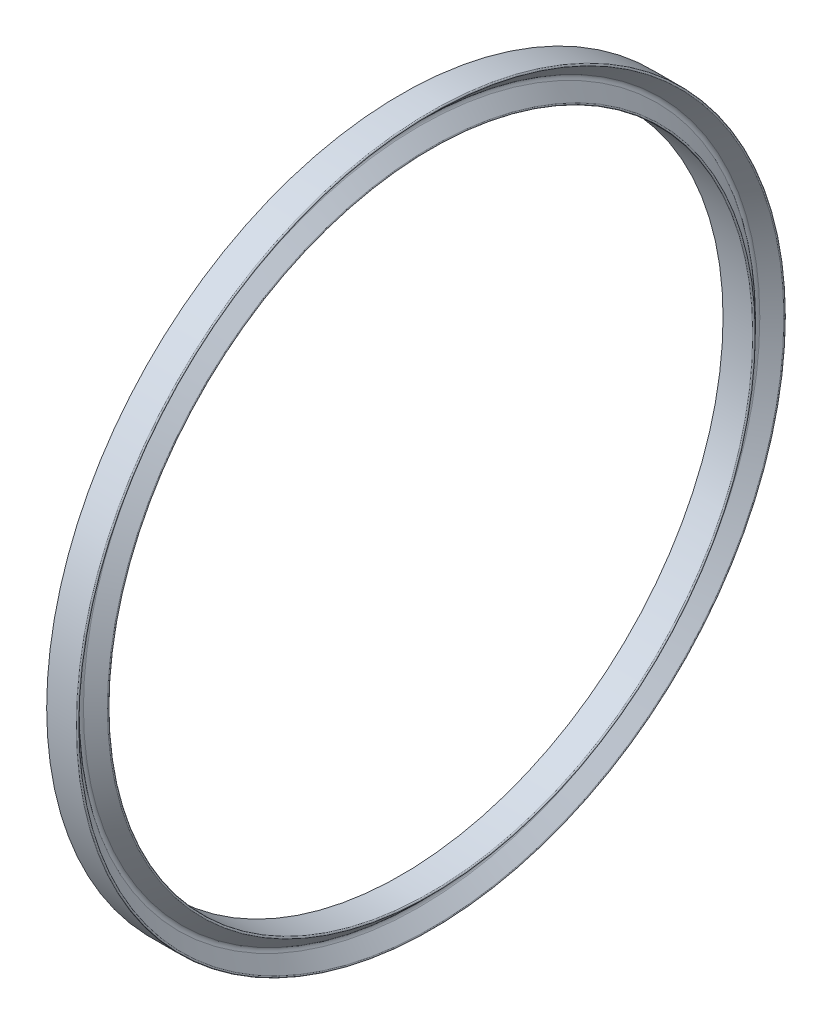
ISO-10303-21;
HEADER;
FILE_DESCRIPTION(('STEP AP214'),'2;1');
FILE_NAME('part.step','',(''),(''),'','','');
FILE_SCHEMA(('AUTOMOTIVE_DESIGN { 1 0 10303 214 1 1 1 1 }'));
ENDSEC;
DATA;
#1=APPLICATION_CONTEXT('core data for automotive mechanical design processes');
#2=APPLICATION_PROTOCOL_DEFINITION('international standard','automotive_design',2000,#1);
#3=PRODUCT_CONTEXT('',#1,'mechanical');
#4=PRODUCT('Part','Part','',(#3));
#5=PRODUCT_RELATED_PRODUCT_CATEGORY('part','',(#4));
#6=PRODUCT_DEFINITION_FORMATION('','',#4);
#7=PRODUCT_DEFINITION_CONTEXT('part definition',#1,'design');
#8=PRODUCT_DEFINITION('design','',#6,#7);
#9=PRODUCT_DEFINITION_SHAPE('','',#8);
#10=(LENGTH_UNIT() NAMED_UNIT(*) SI_UNIT(.MILLI.,.METRE.));
#11=(NAMED_UNIT(*) PLANE_ANGLE_UNIT() SI_UNIT($,.RADIAN.));
#12=(NAMED_UNIT(*) SI_UNIT($,.STERADIAN.) SOLID_ANGLE_UNIT());
#13=UNCERTAINTY_MEASURE_WITH_UNIT(LENGTH_MEASURE(1.E-05),#10,'distance_accuracy_value','');
#14=(GEOMETRIC_REPRESENTATION_CONTEXT(3) GLOBAL_UNCERTAINTY_ASSIGNED_CONTEXT((#13)) GLOBAL_UNIT_ASSIGNED_CONTEXT((#10,
#11,#12)) REPRESENTATION_CONTEXT('',''));
#15=CARTESIAN_POINT('',(0.,0.,0.));
#16=DIRECTION('',(0.,0.,1.));
#17=DIRECTION('',(1.,0.,0.));
#18=AXIS2_PLACEMENT_3D('',#15,#16,#17);
#19=CARTESIAN_POINT('',(-58.5481657407606,-30.0000000000006,-1.66533453693773E-13));
#20=DIRECTION('',(-1.,0.,0.));
#21=DIRECTION('',(0.,0.,1.00000000000002));
#22=AXIS2_PLACEMENT_3D('',#19,#20,#21);
#23=PLANE('',#22);
#24=CARTESIAN_POINT('',(-58.5481657407606,0.,2.91433543964104E-13));
#25=DIRECTION('',(-1.,0.,0.));
#26=DIRECTION('',(0.,0.,1.00000000000002));
#27=AXIS2_PLACEMENT_3D('',#24,#25,#26);
#28=CIRCLE('',#27,33.);
#29=CARTESIAN_POINT('',(-58.5481657407606,0.,33.0000000000009));
#30=VERTEX_POINT('',#29);
#31=EDGE_CURVE('E72',#30,#30,#28,.T.);
#32=ORIENTED_EDGE('',*,*,#31,.T.);
#33=EDGE_LOOP('',(#32));
#34=FACE_BOUND('',#33,.T.);
#35=CARTESIAN_POINT('',(-58.5481657407606,0.,2.91433543964104E-13));
#36=DIRECTION('',(-1.,0.,0.));
#37=DIRECTION('',(0.,0.,1.00000000000002));
#38=AXIS2_PLACEMENT_3D('',#35,#36,#37);
#39=CIRCLE('',#38,30.);
#40=CARTESIAN_POINT('',(-58.5481657407606,0.,30.0000000000008));
#41=VERTEX_POINT('',#40);
#42=EDGE_CURVE('E10',#41,#41,#39,.T.);
#43=ORIENTED_EDGE('',*,*,#42,.F.);
#44=EDGE_LOOP('',(#43));
#45=FACE_BOUND('',#44,.T.);
#46=ADVANCED_FACE('F34',(#34,#45),#23,.T.);
#47=CARTESIAN_POINT('',(-76.3247967187445,0.,0.));
#48=DIRECTION('',(-1.,0.,0.));
#49=DIRECTION('',(0.,0.,1.00000000000002));
#50=AXIS2_PLACEMENT_3D('',#47,#48,#49);
#51=CYLINDRICAL_SURFACE('',#50,30.);
#52=ORIENTED_EDGE('',*,*,#42,.T.);
#53=EDGE_LOOP('',(#52));
#54=FACE_BOUND('',#53,.T.);
#55=CARTESIAN_POINT('',(-55.7895870969979,0.,2.91433543964104E-13));
#56=DIRECTION('',(-1.,0.,0.));
#57=DIRECTION('',(0.,0.,1.00000000000002));
#58=AXIS2_PLACEMENT_3D('',#55,#56,#57);
#59=CIRCLE('',#58,30.);
#60=CARTESIAN_POINT('',(-55.7895870969979,0.,30.0000000000008));
#61=VERTEX_POINT('',#60);
#62=EDGE_CURVE('E41',#61,#61,#59,.T.);
#63=ORIENTED_EDGE('',*,*,#62,.F.);
#64=EDGE_LOOP('',(#63));
#65=FACE_BOUND('',#64,.T.);
#66=ADVANCED_FACE('F92',(#54,#65),#51,.F.);
#67=CARTESIAN_POINT('',(-55.7895870969979,0.,2.91433543964104E-13));
#68=DIRECTION('',(-1.,0.,0.));
#69=DIRECTION('',(0.,0.,1.00000000000002));
#70=AXIS2_PLACEMENT_3D('',#67,#68,#69);
#71=TOROIDAL_SURFACE('',#70,30.1,0.0999999999999998);
#72=ORIENTED_EDGE('',*,*,#62,.T.);
#73=EDGE_LOOP('',(#72));
#74=FACE_BOUND('',#73,.T.);
#75=CARTESIAN_POINT('',(-55.7188764188792,0.,2.91433543964104E-13));
#76=DIRECTION('',(-1.,0.,0.));
#77=DIRECTION('',(0.,0.,1.00000000000002));
#78=AXIS2_PLACEMENT_3D('',#75,#76,#77);
#79=CIRCLE('',#78,30.1707106781187);
#80=CARTESIAN_POINT('',(-55.7188764188792,0.,30.1707106781195));
#81=VERTEX_POINT('',#80);
#82=EDGE_CURVE('E48',#81,#81,#79,.T.);
#83=ORIENTED_EDGE('',*,*,#82,.F.);
#84=EDGE_LOOP('',(#83));
#85=FACE_BOUND('',#84,.T.);
#86=ADVANCED_FACE('F96',(#74,#85),#71,.T.);
#87=CARTESIAN_POINT('',(-56.8360337064046,0.,2.91433543964104E-13));
#88=DIRECTION('',(-1.,0.,0.));
#89=DIRECTION('',(0.,0.,1.00000000000002));
#90=AXIS2_PLACEMENT_3D('',#87,#88,#89);
#91=CONICAL_SURFACE('',#90,31.287867965644,0.785398163397448);
#92=ORIENTED_EDGE('',*,*,#82,.T.);
#93=EDGE_LOOP('',(#92));
#94=FACE_BOUND('',#93,.T.);
#95=CARTESIAN_POINT('',(-56.8360337064046,0.,2.91433543964104E-13));
#96=DIRECTION('',(-1.,0.,0.));
#97=DIRECTION('',(0.,0.,1.00000000000002));
#98=AXIS2_PLACEMENT_3D('',#95,#96,#97);
#99=CIRCLE('',#98,31.287867965644);
#100=CARTESIAN_POINT('',(-56.8360337064046,0.,31.2878679656449));
#101=VERTEX_POINT('',#100);
#102=EDGE_CURVE('E54',#101,#101,#99,.T.);
#103=ORIENTED_EDGE('',*,*,#102,.F.);
#104=EDGE_LOOP('',(#103));
#105=FACE_BOUND('',#104,.T.);
#106=ADVANCED_FACE('F100',(#94,#105),#91,.T.);
#107=CARTESIAN_POINT('',(-56.6239016720487,0.,2.91433543964104E-13));
#108=DIRECTION('',(-1.,0.,0.));
#109=DIRECTION('',(0.,0.,1.00000000000002));
#110=AXIS2_PLACEMENT_3D('',#107,#108,#109);
#111=TOROIDAL_SURFACE('',#110,31.5,0.299999999999998);
#112=ORIENTED_EDGE('',*,*,#102,.T.);
#113=EDGE_LOOP('',(#112));
#114=FACE_BOUND('',#113,.T.);
#115=CARTESIAN_POINT('',(-56.8360337064046,0.,2.91433543964104E-13));
#116=DIRECTION('',(-1.,0.,0.));
#117=DIRECTION('',(0.,0.,1.00000000000002));
#118=AXIS2_PLACEMENT_3D('',#115,#116,#117);
#119=CIRCLE('',#118,31.712132034356);
#120=CARTESIAN_POINT('',(-56.8360337064046,0.,31.7121320343568));
#121=VERTEX_POINT('',#120);
#122=EDGE_CURVE('E60',#121,#121,#119,.T.);
#123=ORIENTED_EDGE('',*,*,#122,.F.);
#124=EDGE_LOOP('',(#123));
#125=FACE_BOUND('',#124,.T.);
#126=ADVANCED_FACE('F106',(#114,#125),#111,.F.);
#127=CARTESIAN_POINT('',(-55.7188764188792,0.,2.91433543964104E-13));
#128=DIRECTION('',(1.,0.,0.));
#129=DIRECTION('',(0.,0.,-1.00000000000002));
#130=AXIS2_PLACEMENT_3D('',#127,#128,#129);
#131=CONICAL_SURFACE('',#130,32.8292893218813,0.785398163397448);
#132=ORIENTED_EDGE('',*,*,#122,.T.);
#133=EDGE_LOOP('',(#132));
#134=FACE_BOUND('',#133,.T.);
#135=CARTESIAN_POINT('',(-55.7188764188792,0.,2.91433543964104E-13));
#136=DIRECTION('',(-1.,0.,0.));
#137=DIRECTION('',(0.,0.,1.00000000000002));
#138=AXIS2_PLACEMENT_3D('',#135,#136,#137);
#139=CIRCLE('',#138,32.8292893218813);
#140=CARTESIAN_POINT('',(-55.7188764188792,0.,32.8292893218822));
#141=VERTEX_POINT('',#140);
#142=EDGE_CURVE('E64',#141,#141,#139,.T.);
#143=ORIENTED_EDGE('',*,*,#142,.F.);
#144=EDGE_LOOP('',(#143));
#145=FACE_BOUND('',#144,.T.);
#146=ADVANCED_FACE('F88',(#134,#145),#131,.F.);
#147=CARTESIAN_POINT('',(-55.7895870969979,0.,2.91433543964104E-13));
#148=DIRECTION('',(-1.,0.,0.));
#149=DIRECTION('',(0.,0.,1.00000000000002));
#150=AXIS2_PLACEMENT_3D('',#147,#148,#149);
#151=TOROIDAL_SURFACE('',#150,32.9,0.1);
#152=ORIENTED_EDGE('',*,*,#142,.T.);
#153=EDGE_LOOP('',(#152));
#154=FACE_BOUND('',#153,.T.);
#155=CARTESIAN_POINT('',(-55.7895870969979,0.,2.91433543964104E-13));
#156=DIRECTION('',(-1.,0.,0.));
#157=DIRECTION('',(0.,0.,1.00000000000002));
#158=AXIS2_PLACEMENT_3D('',#155,#156,#157);
#159=CIRCLE('',#158,33.);
#160=CARTESIAN_POINT('',(-55.7895870969979,0.,33.0000000000009));
#161=VERTEX_POINT('',#160);
#162=EDGE_CURVE('E68',#161,#161,#159,.T.);
#163=ORIENTED_EDGE('',*,*,#162,.F.);
#164=EDGE_LOOP('',(#163));
#165=FACE_BOUND('',#164,.T.);
#166=ADVANCED_FACE('F82',(#154,#165),#151,.T.);
#167=CARTESIAN_POINT('',(-76.3247967187445,0.,0.));
#168=DIRECTION('',(-1.,0.,0.));
#169=DIRECTION('',(0.,0.,1.00000000000002));
#170=AXIS2_PLACEMENT_3D('',#167,#168,#169);
#171=CYLINDRICAL_SURFACE('',#170,33.);
#172=ORIENTED_EDGE('',*,*,#162,.T.);
#173=EDGE_LOOP('',(#172));
#174=FACE_BOUND('',#173,.T.);
#175=ORIENTED_EDGE('',*,*,#31,.F.);
#176=EDGE_LOOP('',(#175));
#177=FACE_BOUND('',#176,.T.);
#178=ADVANCED_FACE('F80',(#174,#177),#171,.T.);
#179=CLOSED_SHELL('',(#46,#66,#86,#106,#126,#146,#166,#178));
#180=MANIFOLD_SOLID_BREP('B2',#179);
#181=ADVANCED_BREP_SHAPE_REPRESENTATION('',(#18,#180),#14);
#182=SHAPE_DEFINITION_REPRESENTATION(#9,#181);
ENDSEC;
END-ISO-10303-21;
